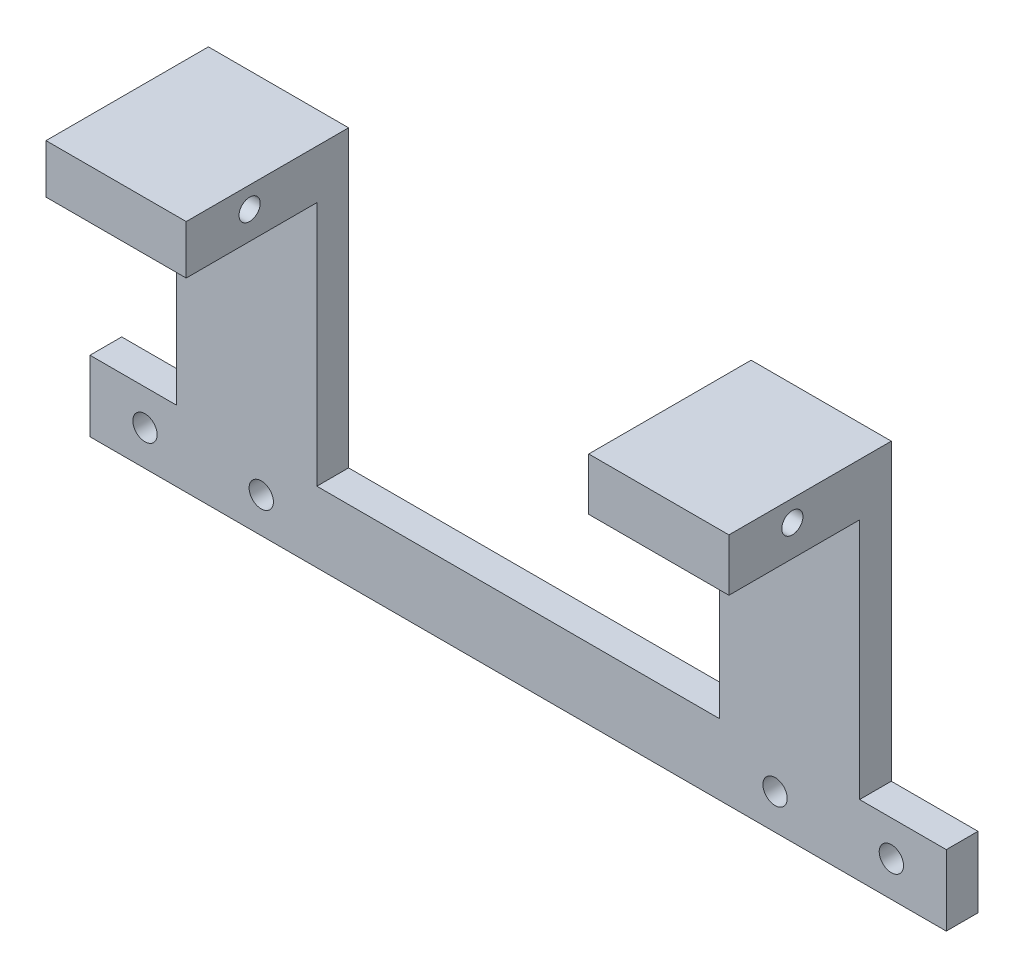
ISO-10303-21;
HEADER;
FILE_DESCRIPTION(('STEP AP214'),'2;1');
FILE_NAME('part.step','',(''),(''),'','','');
FILE_SCHEMA(('AUTOMOTIVE_DESIGN { 1 0 10303 214 1 1 1 1 }'));
ENDSEC;
DATA;
#1=APPLICATION_CONTEXT('core data for automotive mechanical design processes');
#2=APPLICATION_PROTOCOL_DEFINITION('international standard','automotive_design',2000,#1);
#3=PRODUCT_CONTEXT('',#1,'mechanical');
#4=PRODUCT('Part','Part','',(#3));
#5=PRODUCT_RELATED_PRODUCT_CATEGORY('part','',(#4));
#6=PRODUCT_DEFINITION_FORMATION('','',#4);
#7=PRODUCT_DEFINITION_CONTEXT('part definition',#1,'design');
#8=PRODUCT_DEFINITION('design','',#6,#7);
#9=PRODUCT_DEFINITION_SHAPE('','',#8);
#10=(LENGTH_UNIT() NAMED_UNIT(*) SI_UNIT(.MILLI.,.METRE.));
#11=(NAMED_UNIT(*) PLANE_ANGLE_UNIT() SI_UNIT($,.RADIAN.));
#12=(NAMED_UNIT(*) SI_UNIT($,.STERADIAN.) SOLID_ANGLE_UNIT());
#13=UNCERTAINTY_MEASURE_WITH_UNIT(LENGTH_MEASURE(1.E-05),#10,'distance_accuracy_value','');
#14=(GEOMETRIC_REPRESENTATION_CONTEXT(3) GLOBAL_UNCERTAINTY_ASSIGNED_CONTEXT((#13)) GLOBAL_UNIT_ASSIGNED_CONTEXT((#10,
#11,#12)) REPRESENTATION_CONTEXT('',''));
#15=CARTESIAN_POINT('',(0.,0.,0.));
#16=DIRECTION('',(0.,0.,1.));
#17=DIRECTION('',(1.,0.,0.));
#18=AXIS2_PLACEMENT_3D('',#15,#16,#17);
#19=CARTESIAN_POINT('',(0.,0.,3.));
#20=DIRECTION('',(0.,0.,1.));
#21=DIRECTION('',(1.,0.,0.));
#22=AXIS2_PLACEMENT_3D('',#19,#20,#21);
#23=PLANE('',#22);
#24=CARTESIAN_POINT('',(24.2994439115604,-13.7725913758343,3.));
#25=DIRECTION('',(0.,0.,1.));
#26=DIRECTION('',(1.,0.,0.));
#27=AXIS2_PLACEMENT_3D('',#24,#25,#26);
#28=CIRCLE('',#27,1.15);
#29=CARTESIAN_POINT('',(25.4494439115604,-13.7725913758343,3.));
#30=VERTEX_POINT('',#29);
#31=EDGE_CURVE('E203',#30,#30,#28,.T.);
#32=ORIENTED_EDGE('',*,*,#31,.F.);
#33=EDGE_LOOP('',(#32));
#34=FACE_BOUND('',#33,.T.);
#35=CARTESIAN_POINT('',(-35.3005560884396,-13.7725913758343,3.));
#36=DIRECTION('',(0.,0.,1.));
#37=DIRECTION('',(1.,0.,0.));
#38=AXIS2_PLACEMENT_3D('',#35,#36,#37);
#39=CIRCLE('',#38,1.15);
#40=CARTESIAN_POINT('',(-34.1505560884396,-13.7725913758343,3.));
#41=VERTEX_POINT('',#40);
#42=EDGE_CURVE('E215',#41,#41,#39,.T.);
#43=ORIENTED_EDGE('',*,*,#42,.F.);
#44=EDGE_LOOP('',(#43));
#45=FACE_BOUND('',#44,.T.);
#46=CARTESIAN_POINT('',(-24.3005560884396,-13.7725913758343,3.));
#47=DIRECTION('',(0.,0.,1.));
#48=DIRECTION('',(1.,0.,0.));
#49=AXIS2_PLACEMENT_3D('',#46,#47,#48);
#50=CIRCLE('',#49,1.15);
#51=CARTESIAN_POINT('',(-23.1505560884396,-13.7725913758343,3.));
#52=VERTEX_POINT('',#51);
#53=EDGE_CURVE('E209',#52,#52,#50,.T.);
#54=ORIENTED_EDGE('',*,*,#53,.F.);
#55=EDGE_LOOP('',(#54));
#56=FACE_BOUND('',#55,.T.);
#57=CARTESIAN_POINT('',(35.2994439115604,-13.7725913758343,3.));
#58=DIRECTION('',(0.,0.,1.));
#59=DIRECTION('',(1.,0.,0.));
#60=AXIS2_PLACEMENT_3D('',#57,#58,#59);
#61=CIRCLE('',#60,1.15);
#62=CARTESIAN_POINT('',(36.4494439115604,-13.7725913758343,3.));
#63=VERTEX_POINT('',#62);
#64=EDGE_CURVE('E197',#63,#63,#61,.T.);
#65=ORIENTED_EDGE('',*,*,#64,.F.);
#66=EDGE_LOOP('',(#65));
#67=FACE_BOUND('',#66,.T.);
#68=DIRECTION('',(0.,1.,0.));
#69=VECTOR('',#68,1.);
#70=CARTESIAN_POINT('',(32.2934439115604,17.4274086241657,3.));
#71=LINE('',#70,#69);
#72=CARTESIAN_POINT('',(32.2934439115604,-10.4325913758343,3.));
#73=VERTEX_POINT('',#72);
#74=CARTESIAN_POINT('',(32.2934439115604,12.4795403289795,3.));
#75=VERTEX_POINT('',#74);
#76=EDGE_CURVE('E51',#73,#75,#71,.T.);
#77=ORIENTED_EDGE('',*,*,#76,.T.);
#78=DIRECTION('',(1.,0.,0.));
#79=VECTOR('',#78,1.);
#80=CARTESIAN_POINT('',(19.0334439115604,12.4795403289795,3.));
#81=LINE('',#80,#79);
#82=CARTESIAN_POINT('',(19.0334439115604,12.4795403289795,3.));
#83=VERTEX_POINT('',#82);
#84=EDGE_CURVE('E169',#83,#75,#81,.T.);
#85=ORIENTED_EDGE('',*,*,#84,.F.);
#86=DIRECTION('',(0.,-1.,0.));
#87=VECTOR('',#86,1.);
#88=CARTESIAN_POINT('',(19.0334439115604,-10.4325913758343,3.));
#89=LINE('',#88,#87);
#90=CARTESIAN_POINT('',(19.0334439115604,-10.4325913758343,3.));
#91=VERTEX_POINT('',#90);
#92=EDGE_CURVE('E173',#83,#91,#89,.T.);
#93=ORIENTED_EDGE('',*,*,#92,.T.);
#94=DIRECTION('',(-1.,0.,0.));
#95=VECTOR('',#94,1.);
#96=CARTESIAN_POINT('',(-19.0405560884396,-10.4325913758343,3.));
#97=LINE('',#96,#95);
#98=CARTESIAN_POINT('',(-19.0405560884396,-10.4325913758343,3.));
#99=VERTEX_POINT('',#98);
#100=EDGE_CURVE('E235',#91,#99,#97,.T.);
#101=ORIENTED_EDGE('',*,*,#100,.T.);
#102=DIRECTION('',(0.,1.,0.));
#103=VECTOR('',#102,1.);
#104=CARTESIAN_POINT('',(-19.0405560884396,17.4274086241657,3.));
#105=LINE('',#104,#103);
#106=CARTESIAN_POINT('',(-19.0405560884396,12.7974086241657,3.));
#107=VERTEX_POINT('',#106);
#108=EDGE_CURVE('E237',#99,#107,#105,.T.);
#109=ORIENTED_EDGE('',*,*,#108,.T.);
#110=DIRECTION('',(1.,0.,0.));
#111=VECTOR('',#110,1.);
#112=CARTESIAN_POINT('',(-32.3005560884396,12.7974086241657,3.));
#113=LINE('',#112,#111);
#114=CARTESIAN_POINT('',(-32.3005560884396,12.7974086241657,3.));
#115=VERTEX_POINT('',#114);
#116=EDGE_CURVE('E58',#115,#107,#113,.T.);
#117=ORIENTED_EDGE('',*,*,#116,.F.);
#118=DIRECTION('',(0.,-1.,0.));
#119=VECTOR('',#118,1.);
#120=CARTESIAN_POINT('',(-32.3005560884396,-10.4325913758343,3.));
#121=LINE('',#120,#119);
#122=CARTESIAN_POINT('',(-32.3005560884396,-10.4325913758343,3.));
#123=VERTEX_POINT('',#122);
#124=EDGE_CURVE('E239',#115,#123,#121,.T.);
#125=ORIENTED_EDGE('',*,*,#124,.T.);
#126=DIRECTION('',(-1.,0.,0.));
#127=VECTOR('',#126,1.);
#128=CARTESIAN_POINT('',(-40.5005560884396,-10.4325913758343,3.));
#129=LINE('',#128,#127);
#130=CARTESIAN_POINT('',(-40.5005560884396,-10.4325913758343,3.));
#131=VERTEX_POINT('',#130);
#132=EDGE_CURVE('E221',#123,#131,#129,.T.);
#133=ORIENTED_EDGE('',*,*,#132,.T.);
#134=DIRECTION('',(0.,-1.,0.));
#135=VECTOR('',#134,1.);
#136=CARTESIAN_POINT('',(-40.5005560884396,-17.1125913758343,3.));
#137=LINE('',#136,#135);
#138=CARTESIAN_POINT('',(-40.5005560884396,-17.1125913758343,3.));
#139=VERTEX_POINT('',#138);
#140=EDGE_CURVE('E224',#131,#139,#137,.T.);
#141=ORIENTED_EDGE('',*,*,#140,.T.);
#142=DIRECTION('',(1.,0.,0.));
#143=VECTOR('',#142,1.);
#144=CARTESIAN_POINT('',(40.4934439115604,-17.1125913758343,3.));
#145=LINE('',#144,#143);
#146=CARTESIAN_POINT('',(40.4934439115604,-17.1125913758343,3.));
#147=VERTEX_POINT('',#146);
#148=EDGE_CURVE('E227',#139,#147,#145,.T.);
#149=ORIENTED_EDGE('',*,*,#148,.T.);
#150=DIRECTION('',(0.,1.,0.));
#151=VECTOR('',#150,1.);
#152=CARTESIAN_POINT('',(40.4934439115604,-10.4325913758343,3.));
#153=LINE('',#152,#151);
#154=CARTESIAN_POINT('',(40.4934439115604,-10.4325913758343,3.));
#155=VERTEX_POINT('',#154);
#156=EDGE_CURVE('E229',#147,#155,#153,.T.);
#157=ORIENTED_EDGE('',*,*,#156,.T.);
#158=DIRECTION('',(-1.,0.,0.));
#159=VECTOR('',#158,1.);
#160=CARTESIAN_POINT('',(32.2934439115604,-10.4325913758343,3.));
#161=LINE('',#160,#159);
#162=EDGE_CURVE('E231',#155,#73,#161,.T.);
#163=ORIENTED_EDGE('',*,*,#162,.T.);
#164=EDGE_LOOP('',(#77,#85,#93,#101,#109,#117,#125,#133,#141,#149,#157,#163));
#165=FACE_BOUND('',#164,.T.);
#166=ADVANCED_FACE('F36',(#34,#45,#56,#67,#165),#23,.T.);
#167=CARTESIAN_POINT('',(0.,0.,0.));
#168=DIRECTION('',(0.,0.,1.));
#169=DIRECTION('',(1.,0.,0.));
#170=AXIS2_PLACEMENT_3D('',#167,#168,#169);
#171=PLANE('',#170);
#172=DIRECTION('',(-1.,0.,0.));
#173=VECTOR('',#172,1.);
#174=CARTESIAN_POINT('',(-40.5005560884396,-10.4325913758343,0.));
#175=LINE('',#174,#173);
#176=CARTESIAN_POINT('',(-32.3005560884396,-10.4325913758343,0.));
#177=VERTEX_POINT('',#176);
#178=CARTESIAN_POINT('',(-40.5005560884396,-10.4325913758343,0.));
#179=VERTEX_POINT('',#178);
#180=EDGE_CURVE('E218',#177,#179,#175,.T.);
#181=ORIENTED_EDGE('',*,*,#180,.F.);
#182=DIRECTION('',(0.,-1.,0.));
#183=VECTOR('',#182,1.);
#184=CARTESIAN_POINT('',(-32.3005560884396,-10.4325913758343,0.));
#185=LINE('',#184,#183);
#186=CARTESIAN_POINT('',(-32.3005560884396,17.4274086241657,0.));
#187=VERTEX_POINT('',#186);
#188=EDGE_CURVE('E225',#187,#177,#185,.T.);
#189=ORIENTED_EDGE('',*,*,#188,.F.);
#190=DIRECTION('',(-1.,0.,0.));
#191=VECTOR('',#190,1.);
#192=CARTESIAN_POINT('',(-32.3005560884396,17.4274086241657,0.));
#193=LINE('',#192,#191);
#194=CARTESIAN_POINT('',(-19.0405560884396,17.4274086241657,0.));
#195=VERTEX_POINT('',#194);
#196=EDGE_CURVE('E262',#195,#187,#193,.T.);
#197=ORIENTED_EDGE('',*,*,#196,.F.);
#198=DIRECTION('',(0.,1.,0.));
#199=VECTOR('',#198,1.);
#200=CARTESIAN_POINT('',(-19.0405560884396,17.4274086241657,0.));
#201=LINE('',#200,#199);
#202=CARTESIAN_POINT('',(-19.0405560884396,-10.4325913758343,0.));
#203=VERTEX_POINT('',#202);
#204=EDGE_CURVE('E260',#203,#195,#201,.T.);
#205=ORIENTED_EDGE('',*,*,#204,.F.);
#206=DIRECTION('',(-1.,0.,0.));
#207=VECTOR('',#206,1.);
#208=CARTESIAN_POINT('',(-19.0405560884396,-10.4325913758343,0.));
#209=LINE('',#208,#207);
#210=CARTESIAN_POINT('',(19.0334439115604,-10.4325913758343,0.));
#211=VERTEX_POINT('',#210);
#212=EDGE_CURVE('E258',#211,#203,#209,.T.);
#213=ORIENTED_EDGE('',*,*,#212,.F.);
#214=DIRECTION('',(0.,-1.,0.));
#215=VECTOR('',#214,1.);
#216=CARTESIAN_POINT('',(19.0334439115604,-10.4325913758343,0.));
#217=LINE('',#216,#215);
#218=CARTESIAN_POINT('',(19.0334439115604,17.4274086241657,0.));
#219=VERTEX_POINT('',#218);
#220=EDGE_CURVE('E256',#219,#211,#217,.T.);
#221=ORIENTED_EDGE('',*,*,#220,.F.);
#222=DIRECTION('',(-1.,0.,0.));
#223=VECTOR('',#222,1.);
#224=CARTESIAN_POINT('',(19.0334439115604,17.4274086241657,0.));
#225=LINE('',#224,#223);
#226=CARTESIAN_POINT('',(32.2934439115604,17.4274086241657,0.));
#227=VERTEX_POINT('',#226);
#228=EDGE_CURVE('E254',#227,#219,#225,.T.);
#229=ORIENTED_EDGE('',*,*,#228,.F.);
#230=DIRECTION('',(0.,1.,0.));
#231=VECTOR('',#230,1.);
#232=CARTESIAN_POINT('',(32.2934439115604,17.4274086241657,0.));
#233=LINE('',#232,#231);
#234=CARTESIAN_POINT('',(32.2934439115604,-10.4325913758343,0.));
#235=VERTEX_POINT('',#234);
#236=EDGE_CURVE('E252',#235,#227,#233,.T.);
#237=ORIENTED_EDGE('',*,*,#236,.F.);
#238=DIRECTION('',(-1.,0.,0.));
#239=VECTOR('',#238,1.);
#240=CARTESIAN_POINT('',(32.2934439115604,-10.4325913758343,0.));
#241=LINE('',#240,#239);
#242=CARTESIAN_POINT('',(40.4934439115604,-10.4325913758343,0.));
#243=VERTEX_POINT('',#242);
#244=EDGE_CURVE('E250',#243,#235,#241,.T.);
#245=ORIENTED_EDGE('',*,*,#244,.F.);
#246=DIRECTION('',(0.,1.,0.));
#247=VECTOR('',#246,1.);
#248=CARTESIAN_POINT('',(40.4934439115604,-10.4325913758343,0.));
#249=LINE('',#248,#247);
#250=CARTESIAN_POINT('',(40.4934439115604,-17.1125913758343,0.));
#251=VERTEX_POINT('',#250);
#252=EDGE_CURVE('E248',#251,#243,#249,.T.);
#253=ORIENTED_EDGE('',*,*,#252,.F.);
#254=DIRECTION('',(1.,0.,0.));
#255=VECTOR('',#254,1.);
#256=CARTESIAN_POINT('',(40.4934439115604,-17.1125913758343,0.));
#257=LINE('',#256,#255);
#258=CARTESIAN_POINT('',(-40.5005560884396,-17.1125913758343,0.));
#259=VERTEX_POINT('',#258);
#260=EDGE_CURVE('E246',#259,#251,#257,.T.);
#261=ORIENTED_EDGE('',*,*,#260,.F.);
#262=DIRECTION('',(0.,-1.,0.));
#263=VECTOR('',#262,1.);
#264=CARTESIAN_POINT('',(-40.5005560884396,-17.1125913758343,0.));
#265=LINE('',#264,#263);
#266=EDGE_CURVE('E244',#179,#259,#265,.T.);
#267=ORIENTED_EDGE('',*,*,#266,.F.);
#268=EDGE_LOOP('',(#181,#189,#197,#205,#213,#221,#229,#237,#245,#253,#261,#267));
#269=FACE_BOUND('',#268,.T.);
#270=CARTESIAN_POINT('',(-35.3005560884396,-13.7725913758343,0.));
#271=DIRECTION('',(0.,0.,1.));
#272=DIRECTION('',(1.,0.,0.));
#273=AXIS2_PLACEMENT_3D('',#270,#271,#272);
#274=CIRCLE('',#273,1.15);
#275=CARTESIAN_POINT('',(-34.1505560884396,-13.7725913758343,0.));
#276=VERTEX_POINT('',#275);
#277=EDGE_CURVE('E212',#276,#276,#274,.T.);
#278=ORIENTED_EDGE('',*,*,#277,.T.);
#279=EDGE_LOOP('',(#278));
#280=FACE_BOUND('',#279,.T.);
#281=CARTESIAN_POINT('',(-24.3005560884396,-13.7725913758343,0.));
#282=DIRECTION('',(0.,0.,1.));
#283=DIRECTION('',(1.,0.,0.));
#284=AXIS2_PLACEMENT_3D('',#281,#282,#283);
#285=CIRCLE('',#284,1.15);
#286=CARTESIAN_POINT('',(-23.1505560884396,-13.7725913758343,0.));
#287=VERTEX_POINT('',#286);
#288=EDGE_CURVE('E206',#287,#287,#285,.T.);
#289=ORIENTED_EDGE('',*,*,#288,.T.);
#290=EDGE_LOOP('',(#289));
#291=FACE_BOUND('',#290,.T.);
#292=CARTESIAN_POINT('',(24.2994439115604,-13.7725913758343,0.));
#293=DIRECTION('',(0.,0.,1.));
#294=DIRECTION('',(1.,0.,0.));
#295=AXIS2_PLACEMENT_3D('',#292,#293,#294);
#296=CIRCLE('',#295,1.15);
#297=CARTESIAN_POINT('',(25.4494439115604,-13.7725913758343,0.));
#298=VERTEX_POINT('',#297);
#299=EDGE_CURVE('E200',#298,#298,#296,.T.);
#300=ORIENTED_EDGE('',*,*,#299,.T.);
#301=EDGE_LOOP('',(#300));
#302=FACE_BOUND('',#301,.T.);
#303=CARTESIAN_POINT('',(35.2994439115604,-13.7725913758343,0.));
#304=DIRECTION('',(0.,0.,1.));
#305=DIRECTION('',(1.,0.,0.));
#306=AXIS2_PLACEMENT_3D('',#303,#304,#305);
#307=CIRCLE('',#306,1.15);
#308=CARTESIAN_POINT('',(36.4494439115604,-13.7725913758343,0.));
#309=VERTEX_POINT('',#308);
#310=EDGE_CURVE('E196',#309,#309,#307,.T.);
#311=ORIENTED_EDGE('',*,*,#310,.T.);
#312=EDGE_LOOP('',(#311));
#313=FACE_BOUND('',#312,.T.);
#314=ADVANCED_FACE('F303',(#269,#280,#291,#302,#313),#171,.F.);
#315=CARTESIAN_POINT('',(-40.5005560884396,-10.4325913758343,3.));
#316=DIRECTION('',(0.,-1.,0.));
#317=DIRECTION('',(0.,0.,-1.));
#318=AXIS2_PLACEMENT_3D('',#315,#316,#317);
#319=PLANE('',#318);
#320=ORIENTED_EDGE('',*,*,#180,.T.);
#321=DIRECTION('',(0.,0.,-1.));
#322=VECTOR('',#321,1.);
#323=CARTESIAN_POINT('',(-40.5005560884396,-10.4325913758343,3.));
#324=LINE('',#323,#322);
#325=EDGE_CURVE('E11',#131,#179,#324,.T.);
#326=ORIENTED_EDGE('',*,*,#325,.F.);
#327=ORIENTED_EDGE('',*,*,#132,.F.);
#328=DIRECTION('',(0.,0.,-1.));
#329=VECTOR('',#328,1.);
#330=CARTESIAN_POINT('',(-32.3005560884396,-10.4325913758343,3.));
#331=LINE('',#330,#329);
#332=EDGE_CURVE('E241',#123,#177,#331,.T.);
#333=ORIENTED_EDGE('',*,*,#332,.T.);
#334=EDGE_LOOP('',(#320,#326,#327,#333));
#335=FACE_BOUND('',#334,.T.);
#336=ADVANCED_FACE('F38',(#335),#319,.F.);
#337=CARTESIAN_POINT('',(-40.5005560884396,-17.1125913758343,3.));
#338=DIRECTION('',(1.,0.,0.));
#339=DIRECTION('',(0.,0.,-1.));
#340=AXIS2_PLACEMENT_3D('',#337,#338,#339);
#341=PLANE('',#340);
#342=ORIENTED_EDGE('',*,*,#266,.T.);
#343=DIRECTION('',(0.,0.,-1.));
#344=VECTOR('',#343,1.);
#345=CARTESIAN_POINT('',(-40.5005560884396,-17.1125913758343,3.));
#346=LINE('',#345,#344);
#347=EDGE_CURVE('E44',#139,#259,#346,.T.);
#348=ORIENTED_EDGE('',*,*,#347,.F.);
#349=ORIENTED_EDGE('',*,*,#140,.F.);
#350=ORIENTED_EDGE('',*,*,#325,.T.);
#351=EDGE_LOOP('',(#342,#348,#349,#350));
#352=FACE_BOUND('',#351,.T.);
#353=ADVANCED_FACE('F317',(#352),#341,.F.);
#354=CARTESIAN_POINT('',(40.4934439115604,-17.1125913758343,3.));
#355=DIRECTION('',(0.,1.,0.));
#356=DIRECTION('',(-1.,0.,0.));
#357=AXIS2_PLACEMENT_3D('',#354,#355,#356);
#358=PLANE('',#357);
#359=ORIENTED_EDGE('',*,*,#260,.T.);
#360=DIRECTION('',(0.,0.,-1.));
#361=VECTOR('',#360,1.);
#362=CARTESIAN_POINT('',(40.4934439115604,-17.1125913758343,3.));
#363=LINE('',#362,#361);
#364=EDGE_CURVE('E290',#147,#251,#363,.T.);
#365=ORIENTED_EDGE('',*,*,#364,.F.);
#366=ORIENTED_EDGE('',*,*,#148,.F.);
#367=ORIENTED_EDGE('',*,*,#347,.T.);
#368=EDGE_LOOP('',(#359,#365,#366,#367));
#369=FACE_BOUND('',#368,.T.);
#370=ADVANCED_FACE('F297',(#369),#358,.F.);
#371=CARTESIAN_POINT('',(40.4934439115604,-10.4325913758343,3.));
#372=DIRECTION('',(-1.,0.,0.));
#373=DIRECTION('',(0.,0.,1.));
#374=AXIS2_PLACEMENT_3D('',#371,#372,#373);
#375=PLANE('',#374);
#376=ORIENTED_EDGE('',*,*,#252,.T.);
#377=DIRECTION('',(0.,0.,-1.));
#378=VECTOR('',#377,1.);
#379=CARTESIAN_POINT('',(40.4934439115604,-10.4325913758343,3.));
#380=LINE('',#379,#378);
#381=EDGE_CURVE('E287',#155,#243,#380,.T.);
#382=ORIENTED_EDGE('',*,*,#381,.F.);
#383=ORIENTED_EDGE('',*,*,#156,.F.);
#384=ORIENTED_EDGE('',*,*,#364,.T.);
#385=EDGE_LOOP('',(#376,#382,#383,#384));
#386=FACE_BOUND('',#385,.T.);
#387=ADVANCED_FACE('F309',(#386),#375,.F.);
#388=CARTESIAN_POINT('',(32.2934439115604,-10.4325913758343,3.));
#389=DIRECTION('',(0.,-1.,0.));
#390=DIRECTION('',(0.,0.,-1.));
#391=AXIS2_PLACEMENT_3D('',#388,#389,#390);
#392=PLANE('',#391);
#393=ORIENTED_EDGE('',*,*,#244,.T.);
#394=DIRECTION('',(0.,0.,-1.));
#395=VECTOR('',#394,1.);
#396=CARTESIAN_POINT('',(32.2934439115604,-10.4325913758343,3.));
#397=LINE('',#396,#395);
#398=EDGE_CURVE('E284',#73,#235,#397,.T.);
#399=ORIENTED_EDGE('',*,*,#398,.F.);
#400=ORIENTED_EDGE('',*,*,#162,.F.);
#401=ORIENTED_EDGE('',*,*,#381,.T.);
#402=EDGE_LOOP('',(#393,#399,#400,#401));
#403=FACE_BOUND('',#402,.T.);
#404=ADVANCED_FACE('F313',(#403),#392,.F.);
#405=CARTESIAN_POINT('',(32.2934439115604,17.4274086241657,3.));
#406=DIRECTION('',(-1.,0.,0.));
#407=DIRECTION('',(0.,0.,1.));
#408=AXIS2_PLACEMENT_3D('',#405,#406,#407);
#409=PLANE('',#408);
#410=CARTESIAN_POINT('',(32.2934439115604,15.4274086241657,9.36));
#411=DIRECTION('',(-1.,0.,0.));
#412=DIRECTION('',(0.,0.,1.));
#413=AXIS2_PLACEMENT_3D('',#410,#411,#412);
#414=CIRCLE('',#413,0.999999999999999);
#415=CARTESIAN_POINT('',(32.2934439115604,15.4274086241657,10.36));
#416=VERTEX_POINT('',#415);
#417=EDGE_CURVE('E350',#416,#416,#414,.T.);
#418=ORIENTED_EDGE('',*,*,#417,.T.);
#419=EDGE_LOOP('',(#418));
#420=FACE_BOUND('',#419,.T.);
#421=ORIENTED_EDGE('',*,*,#236,.T.);
#422=DIRECTION('',(0.,0.,-1.));
#423=VECTOR('',#422,1.);
#424=CARTESIAN_POINT('',(32.2934439115604,17.4274086241657,3.));
#425=LINE('',#424,#423);
#426=CARTESIAN_POINT('',(32.2934439115604,17.4274086241657,15.36));
#427=VERTEX_POINT('',#426);
#428=EDGE_CURVE('E281',#427,#227,#425,.T.);
#429=ORIENTED_EDGE('',*,*,#428,.F.);
#430=DIRECTION('',(0.,1.,0.));
#431=VECTOR('',#430,1.);
#432=CARTESIAN_POINT('',(32.2934439115604,17.4274086241657,15.36));
#433=LINE('',#432,#431);
#434=CARTESIAN_POINT('',(32.2934439115604,12.4795403289795,15.36));
#435=VERTEX_POINT('',#434);
#436=EDGE_CURVE('E159',#435,#427,#433,.T.);
#437=ORIENTED_EDGE('',*,*,#436,.F.);
#438=DIRECTION('',(0.,0.,-1.));
#439=VECTOR('',#438,1.);
#440=CARTESIAN_POINT('',(32.2934439115604,12.4795403289795,15.36));
#441=LINE('',#440,#439);
#442=EDGE_CURVE('E155',#435,#75,#441,.T.);
#443=ORIENTED_EDGE('',*,*,#442,.T.);
#444=ORIENTED_EDGE('',*,*,#76,.F.);
#445=ORIENTED_EDGE('',*,*,#398,.T.);
#446=EDGE_LOOP('',(#421,#429,#437,#443,#444,#445));
#447=FACE_BOUND('',#446,.T.);
#448=ADVANCED_FACE('F347',(#420,#447),#409,.F.);
#449=CARTESIAN_POINT('',(19.0334439115604,17.4274086241657,3.));
#450=DIRECTION('',(0.,-1.,0.));
#451=DIRECTION('',(0.,0.,-1.));
#452=AXIS2_PLACEMENT_3D('',#449,#450,#451);
#453=PLANE('',#452);
#454=ORIENTED_EDGE('',*,*,#228,.T.);
#455=DIRECTION('',(0.,0.,-1.));
#456=VECTOR('',#455,1.);
#457=CARTESIAN_POINT('',(19.0334439115604,17.4274086241657,3.));
#458=LINE('',#457,#456);
#459=CARTESIAN_POINT('',(19.0334439115604,17.4274086241657,15.36));
#460=VERTEX_POINT('',#459);
#461=EDGE_CURVE('E279',#460,#219,#458,.T.);
#462=ORIENTED_EDGE('',*,*,#461,.F.);
#463=DIRECTION('',(-1.,0.,0.));
#464=VECTOR('',#463,1.);
#465=CARTESIAN_POINT('',(19.0334439115604,17.4274086241657,15.36));
#466=LINE('',#465,#464);
#467=EDGE_CURVE('E166',#427,#460,#466,.T.);
#468=ORIENTED_EDGE('',*,*,#467,.F.);
#469=ORIENTED_EDGE('',*,*,#428,.T.);
#470=EDGE_LOOP('',(#454,#462,#468,#469));
#471=FACE_BOUND('',#470,.T.);
#472=ADVANCED_FACE('F345',(#471),#453,.F.);
#473=CARTESIAN_POINT('',(19.0334439115604,-10.4325913758343,3.));
#474=DIRECTION('',(1.,0.,0.));
#475=DIRECTION('',(0.,0.,-1.));
#476=AXIS2_PLACEMENT_3D('',#473,#474,#475);
#477=PLANE('',#476);
#478=CARTESIAN_POINT('',(19.0334439115604,15.4274086241657,9.36));
#479=DIRECTION('',(1.,0.,0.));
#480=DIRECTION('',(0.,0.,-1.));
#481=AXIS2_PLACEMENT_3D('',#478,#479,#480);
#482=CIRCLE('',#481,0.999999999999999);
#483=CARTESIAN_POINT('',(19.0334439115604,15.4274086241657,8.36));
#484=VERTEX_POINT('',#483);
#485=EDGE_CURVE('E352',#484,#484,#482,.T.);
#486=ORIENTED_EDGE('',*,*,#485,.T.);
#487=EDGE_LOOP('',(#486));
#488=FACE_BOUND('',#487,.T.);
#489=ORIENTED_EDGE('',*,*,#220,.T.);
#490=DIRECTION('',(0.,0.,-1.));
#491=VECTOR('',#490,1.);
#492=CARTESIAN_POINT('',(19.0334439115604,-10.4325913758343,3.));
#493=LINE('',#492,#491);
#494=EDGE_CURVE('E276',#91,#211,#493,.T.);
#495=ORIENTED_EDGE('',*,*,#494,.F.);
#496=ORIENTED_EDGE('',*,*,#92,.F.);
#497=DIRECTION('',(0.,0.,-1.));
#498=VECTOR('',#497,1.);
#499=CARTESIAN_POINT('',(19.0334439115604,12.4795403289795,15.36));
#500=LINE('',#499,#498);
#501=CARTESIAN_POINT('',(19.0334439115604,12.4795403289795,15.36));
#502=VERTEX_POINT('',#501);
#503=EDGE_CURVE('E153',#502,#83,#500,.T.);
#504=ORIENTED_EDGE('',*,*,#503,.F.);
#505=DIRECTION('',(0.,-1.,0.));
#506=VECTOR('',#505,1.);
#507=CARTESIAN_POINT('',(19.0334439115604,17.4274086241657,15.36));
#508=LINE('',#507,#506);
#509=EDGE_CURVE('E160',#460,#502,#508,.T.);
#510=ORIENTED_EDGE('',*,*,#509,.F.);
#511=ORIENTED_EDGE('',*,*,#461,.T.);
#512=EDGE_LOOP('',(#489,#495,#496,#504,#510,#511));
#513=FACE_BOUND('',#512,.T.);
#514=ADVANCED_FACE('F171',(#488,#513),#477,.F.);
#515=CARTESIAN_POINT('',(-19.0405560884396,-10.4325913758343,3.));
#516=DIRECTION('',(0.,-1.,0.));
#517=DIRECTION('',(0.,0.,-1.));
#518=AXIS2_PLACEMENT_3D('',#515,#516,#517);
#519=PLANE('',#518);
#520=ORIENTED_EDGE('',*,*,#212,.T.);
#521=DIRECTION('',(0.,0.,-1.));
#522=VECTOR('',#521,1.);
#523=CARTESIAN_POINT('',(-19.0405560884396,-10.4325913758343,3.));
#524=LINE('',#523,#522);
#525=EDGE_CURVE('E273',#99,#203,#524,.T.);
#526=ORIENTED_EDGE('',*,*,#525,.F.);
#527=ORIENTED_EDGE('',*,*,#100,.F.);
#528=ORIENTED_EDGE('',*,*,#494,.T.);
#529=EDGE_LOOP('',(#520,#526,#527,#528));
#530=FACE_BOUND('',#529,.T.);
#531=ADVANCED_FACE('F342',(#530),#519,.F.);
#532=CARTESIAN_POINT('',(-19.0405560884396,17.4274086241657,3.));
#533=DIRECTION('',(-1.,0.,0.));
#534=DIRECTION('',(0.,-1.,0.));
#535=AXIS2_PLACEMENT_3D('',#532,#533,#534);
#536=PLANE('',#535);
#537=CARTESIAN_POINT('',(-19.0405560884396,15.4274086241657,9.36));
#538=DIRECTION('',(-1.,0.,0.));
#539=DIRECTION('',(0.,-1.,0.));
#540=AXIS2_PLACEMENT_3D('',#537,#538,#539);
#541=CIRCLE('',#540,0.999999999999999);
#542=CARTESIAN_POINT('',(-19.0405560884396,14.4274086241657,9.36));
#543=VERTEX_POINT('',#542);
#544=EDGE_CURVE('E357',#543,#543,#541,.T.);
#545=ORIENTED_EDGE('',*,*,#544,.T.);
#546=EDGE_LOOP('',(#545));
#547=FACE_BOUND('',#546,.T.);
#548=ORIENTED_EDGE('',*,*,#204,.T.);
#549=DIRECTION('',(0.,0.,-1.));
#550=VECTOR('',#549,1.);
#551=CARTESIAN_POINT('',(-19.0405560884396,17.4274086241657,3.));
#552=LINE('',#551,#550);
#553=CARTESIAN_POINT('',(-19.0405560884396,17.4274086241657,15.36));
#554=VERTEX_POINT('',#553);
#555=EDGE_CURVE('E270',#554,#195,#552,.T.);
#556=ORIENTED_EDGE('',*,*,#555,.F.);
#557=DIRECTION('',(0.,1.,0.));
#558=VECTOR('',#557,1.);
#559=CARTESIAN_POINT('',(-19.0405560884396,17.4274086241657,15.36));
#560=LINE('',#559,#558);
#561=CARTESIAN_POINT('',(-19.0405560884396,12.7974086241657,15.36));
#562=VERTEX_POINT('',#561);
#563=EDGE_CURVE('E184',#562,#554,#560,.T.);
#564=ORIENTED_EDGE('',*,*,#563,.F.);
#565=DIRECTION('',(0.,0.,-1.));
#566=VECTOR('',#565,1.);
#567=CARTESIAN_POINT('',(-19.0405560884396,12.7974086241657,15.36));
#568=LINE('',#567,#566);
#569=EDGE_CURVE('E189',#562,#107,#568,.T.);
#570=ORIENTED_EDGE('',*,*,#569,.T.);
#571=ORIENTED_EDGE('',*,*,#108,.F.);
#572=ORIENTED_EDGE('',*,*,#525,.T.);
#573=EDGE_LOOP('',(#548,#556,#564,#570,#571,#572));
#574=FACE_BOUND('',#573,.T.);
#575=ADVANCED_FACE('F335',(#547,#574),#536,.F.);
#576=CARTESIAN_POINT('',(-32.3005560884396,17.4274086241657,3.));
#577=DIRECTION('',(0.,-1.,0.));
#578=DIRECTION('',(1.,0.,0.));
#579=AXIS2_PLACEMENT_3D('',#576,#577,#578);
#580=PLANE('',#579);
#581=ORIENTED_EDGE('',*,*,#196,.T.);
#582=DIRECTION('',(0.,0.,-1.));
#583=VECTOR('',#582,1.);
#584=CARTESIAN_POINT('',(-32.3005560884396,17.4274086241657,3.));
#585=LINE('',#584,#583);
#586=CARTESIAN_POINT('',(-32.3005560884396,17.4274086241657,15.36));
#587=VERTEX_POINT('',#586);
#588=EDGE_CURVE('E267',#587,#187,#585,.T.);
#589=ORIENTED_EDGE('',*,*,#588,.F.);
#590=DIRECTION('',(-1.,0.,0.));
#591=VECTOR('',#590,1.);
#592=CARTESIAN_POINT('',(-32.3005560884396,17.4274086241657,15.36));
#593=LINE('',#592,#591);
#594=EDGE_CURVE('E187',#554,#587,#593,.T.);
#595=ORIENTED_EDGE('',*,*,#594,.F.);
#596=ORIENTED_EDGE('',*,*,#555,.T.);
#597=EDGE_LOOP('',(#581,#589,#595,#596));
#598=FACE_BOUND('',#597,.T.);
#599=ADVANCED_FACE('F329',(#598),#580,.F.);
#600=CARTESIAN_POINT('',(-32.3005560884396,-10.4325913758343,3.));
#601=DIRECTION('',(1.,0.,0.));
#602=DIRECTION('',(0.,0.,-1.));
#603=AXIS2_PLACEMENT_3D('',#600,#601,#602);
#604=PLANE('',#603);
#605=CARTESIAN_POINT('',(-32.3005560884396,15.4274086241657,9.36));
#606=DIRECTION('',(-1.,0.,0.));
#607=DIRECTION('',(0.,0.,1.));
#608=AXIS2_PLACEMENT_3D('',#605,#606,#607);
#609=CIRCLE('',#608,0.999999999999999);
#610=CARTESIAN_POINT('',(-32.3005560884396,15.4274086241657,10.36));
#611=VERTEX_POINT('',#610);
#612=EDGE_CURVE('E362',#611,#611,#609,.T.);
#613=ORIENTED_EDGE('',*,*,#612,.F.);
#614=EDGE_LOOP('',(#613));
#615=FACE_BOUND('',#614,.T.);
#616=ORIENTED_EDGE('',*,*,#188,.T.);
#617=ORIENTED_EDGE('',*,*,#332,.F.);
#618=ORIENTED_EDGE('',*,*,#124,.F.);
#619=DIRECTION('',(0.,0.,-1.));
#620=VECTOR('',#619,1.);
#621=CARTESIAN_POINT('',(-32.3005560884396,12.7974086241657,15.36));
#622=LINE('',#621,#620);
#623=CARTESIAN_POINT('',(-32.3005560884396,12.7974086241657,15.36));
#624=VERTEX_POINT('',#623);
#625=EDGE_CURVE('E193',#624,#115,#622,.T.);
#626=ORIENTED_EDGE('',*,*,#625,.F.);
#627=DIRECTION('',(0.,-1.,0.));
#628=VECTOR('',#627,1.);
#629=CARTESIAN_POINT('',(-32.3005560884396,17.4274086241657,15.36));
#630=LINE('',#629,#628);
#631=EDGE_CURVE('E175',#587,#624,#630,.T.);
#632=ORIENTED_EDGE('',*,*,#631,.F.);
#633=ORIENTED_EDGE('',*,*,#588,.T.);
#634=EDGE_LOOP('',(#616,#617,#618,#626,#632,#633));
#635=FACE_BOUND('',#634,.T.);
#636=ADVANCED_FACE('F324',(#615,#635),#604,.F.);
#637=CARTESIAN_POINT('',(-35.3005560884396,-13.7725913758343,3.));
#638=DIRECTION('',(0.,0.,-1.));
#639=DIRECTION('',(-1.,0.,0.));
#640=AXIS2_PLACEMENT_3D('',#637,#638,#639);
#641=CYLINDRICAL_SURFACE('',#640,1.15);
#642=ORIENTED_EDGE('',*,*,#42,.T.);
#643=EDGE_LOOP('',(#642));
#644=FACE_BOUND('',#643,.T.);
#645=ORIENTED_EDGE('',*,*,#277,.F.);
#646=EDGE_LOOP('',(#645));
#647=FACE_BOUND('',#646,.T.);
#648=ADVANCED_FACE('F370',(#644,#647),#641,.F.);
#649=CARTESIAN_POINT('',(-24.3005560884396,-13.7725913758343,3.));
#650=DIRECTION('',(0.,0.,-1.));
#651=DIRECTION('',(-1.,0.,0.));
#652=AXIS2_PLACEMENT_3D('',#649,#650,#651);
#653=CYLINDRICAL_SURFACE('',#652,1.15);
#654=ORIENTED_EDGE('',*,*,#53,.T.);
#655=EDGE_LOOP('',(#654));
#656=FACE_BOUND('',#655,.T.);
#657=ORIENTED_EDGE('',*,*,#288,.F.);
#658=EDGE_LOOP('',(#657));
#659=FACE_BOUND('',#658,.T.);
#660=ADVANCED_FACE('F376',(#656,#659),#653,.F.);
#661=CARTESIAN_POINT('',(24.2994439115604,-13.7725913758343,3.));
#662=DIRECTION('',(0.,0.,-1.));
#663=DIRECTION('',(-1.,0.,0.));
#664=AXIS2_PLACEMENT_3D('',#661,#662,#663);
#665=CYLINDRICAL_SURFACE('',#664,1.15);
#666=ORIENTED_EDGE('',*,*,#31,.T.);
#667=EDGE_LOOP('',(#666));
#668=FACE_BOUND('',#667,.T.);
#669=ORIENTED_EDGE('',*,*,#299,.F.);
#670=EDGE_LOOP('',(#669));
#671=FACE_BOUND('',#670,.T.);
#672=ADVANCED_FACE('F392',(#668,#671),#665,.F.);
#673=CARTESIAN_POINT('',(35.2994439115604,-13.7725913758343,3.));
#674=DIRECTION('',(0.,0.,-1.));
#675=DIRECTION('',(-1.,0.,0.));
#676=AXIS2_PLACEMENT_3D('',#673,#674,#675);
#677=CYLINDRICAL_SURFACE('',#676,1.15);
#678=ORIENTED_EDGE('',*,*,#64,.T.);
#679=EDGE_LOOP('',(#678));
#680=FACE_BOUND('',#679,.T.);
#681=ORIENTED_EDGE('',*,*,#310,.F.);
#682=EDGE_LOOP('',(#681));
#683=FACE_BOUND('',#682,.T.);
#684=ADVANCED_FACE('F396',(#680,#683),#677,.F.);
#685=CARTESIAN_POINT('',(-32.3005560884396,12.7974086241657,15.36));
#686=DIRECTION('',(0.,1.,0.));
#687=DIRECTION('',(0.,0.,1.));
#688=AXIS2_PLACEMENT_3D('',#685,#686,#687);
#689=PLANE('',#688);
#690=ORIENTED_EDGE('',*,*,#116,.T.);
#691=ORIENTED_EDGE('',*,*,#569,.F.);
#692=DIRECTION('',(1.,0.,0.));
#693=VECTOR('',#692,1.);
#694=CARTESIAN_POINT('',(-32.3005560884396,12.7974086241657,15.36));
#695=LINE('',#694,#693);
#696=EDGE_CURVE('E182',#624,#562,#695,.T.);
#697=ORIENTED_EDGE('',*,*,#696,.F.);
#698=ORIENTED_EDGE('',*,*,#625,.T.);
#699=EDGE_LOOP('',(#690,#691,#697,#698));
#700=FACE_BOUND('',#699,.T.);
#701=ADVANCED_FACE('F400',(#700),#689,.F.);
#702=CARTESIAN_POINT('',(0.,0.,15.36));
#703=DIRECTION('',(0.,0.,1.));
#704=DIRECTION('',(1.,0.,0.));
#705=AXIS2_PLACEMENT_3D('',#702,#703,#704);
#706=PLANE('',#705);
#707=ORIENTED_EDGE('',*,*,#631,.T.);
#708=ORIENTED_EDGE('',*,*,#696,.T.);
#709=ORIENTED_EDGE('',*,*,#563,.T.);
#710=ORIENTED_EDGE('',*,*,#594,.T.);
#711=EDGE_LOOP('',(#707,#708,#709,#710));
#712=FACE_BOUND('',#711,.T.);
#713=ADVANCED_FACE('F331',(#712),#706,.T.);
#714=CARTESIAN_POINT('',(19.0334439115604,12.4795403289795,15.36));
#715=DIRECTION('',(0.,1.,0.));
#716=DIRECTION('',(0.,0.,1.));
#717=AXIS2_PLACEMENT_3D('',#714,#715,#716);
#718=PLANE('',#717);
#719=ORIENTED_EDGE('',*,*,#84,.T.);
#720=ORIENTED_EDGE('',*,*,#442,.F.);
#721=DIRECTION('',(1.,0.,0.));
#722=VECTOR('',#721,1.);
#723=CARTESIAN_POINT('',(19.0334439115604,12.4795403289795,15.36));
#724=LINE('',#723,#722);
#725=EDGE_CURVE('E149',#502,#435,#724,.T.);
#726=ORIENTED_EDGE('',*,*,#725,.F.);
#727=ORIENTED_EDGE('',*,*,#503,.T.);
#728=EDGE_LOOP('',(#719,#720,#726,#727));
#729=FACE_BOUND('',#728,.T.);
#730=ADVANCED_FACE('F151',(#729),#718,.F.);
#731=CARTESIAN_POINT('',(0.,0.,15.36));
#732=DIRECTION('',(0.,0.,1.));
#733=DIRECTION('',(1.,0.,0.));
#734=AXIS2_PLACEMENT_3D('',#731,#732,#733);
#735=PLANE('',#734);
#736=ORIENTED_EDGE('',*,*,#509,.T.);
#737=ORIENTED_EDGE('',*,*,#725,.T.);
#738=ORIENTED_EDGE('',*,*,#436,.T.);
#739=ORIENTED_EDGE('',*,*,#467,.T.);
#740=EDGE_LOOP('',(#736,#737,#738,#739));
#741=FACE_BOUND('',#740,.T.);
#742=ADVANCED_FACE('F164',(#741),#735,.T.);
#743=CARTESIAN_POINT('',(67.6994439115604,15.4274086241657,9.36));
#744=DIRECTION('',(-1.,0.,0.));
#745=DIRECTION('',(0.,0.,1.));
#746=AXIS2_PLACEMENT_3D('',#743,#744,#745);
#747=CYLINDRICAL_SURFACE('',#746,0.999999999999999);
#748=ORIENTED_EDGE('',*,*,#612,.T.);
#749=EDGE_LOOP('',(#748));
#750=FACE_BOUND('',#749,.T.);
#751=ORIENTED_EDGE('',*,*,#544,.F.);
#752=EDGE_LOOP('',(#751));
#753=FACE_BOUND('',#752,.T.);
#754=ADVANCED_FACE('F366',(#750,#753),#747,.F.);
#755=ORIENTED_EDGE('',*,*,#485,.F.);
#756=EDGE_LOOP('',(#755));
#757=FACE_BOUND('',#756,.T.);
#758=ORIENTED_EDGE('',*,*,#417,.F.);
#759=EDGE_LOOP('',(#758));
#760=FACE_BOUND('',#759,.T.);
#761=ADVANCED_FACE('F411',(#757,#760),#747,.F.);
#762=CLOSED_SHELL('',(#166,#314,#336,#353,#370,#387,#404,#448,#472,#514,#531,#575,#599,#636,
#648,#660,#672,#684,#701,#713,#730,#742,#754,#761));
#763=MANIFOLD_SOLID_BREP('B2',#762);
#764=ADVANCED_BREP_SHAPE_REPRESENTATION('',(#18,#763),#14);
#765=SHAPE_DEFINITION_REPRESENTATION(#9,#764);
ENDSEC;
END-ISO-10303-21;
